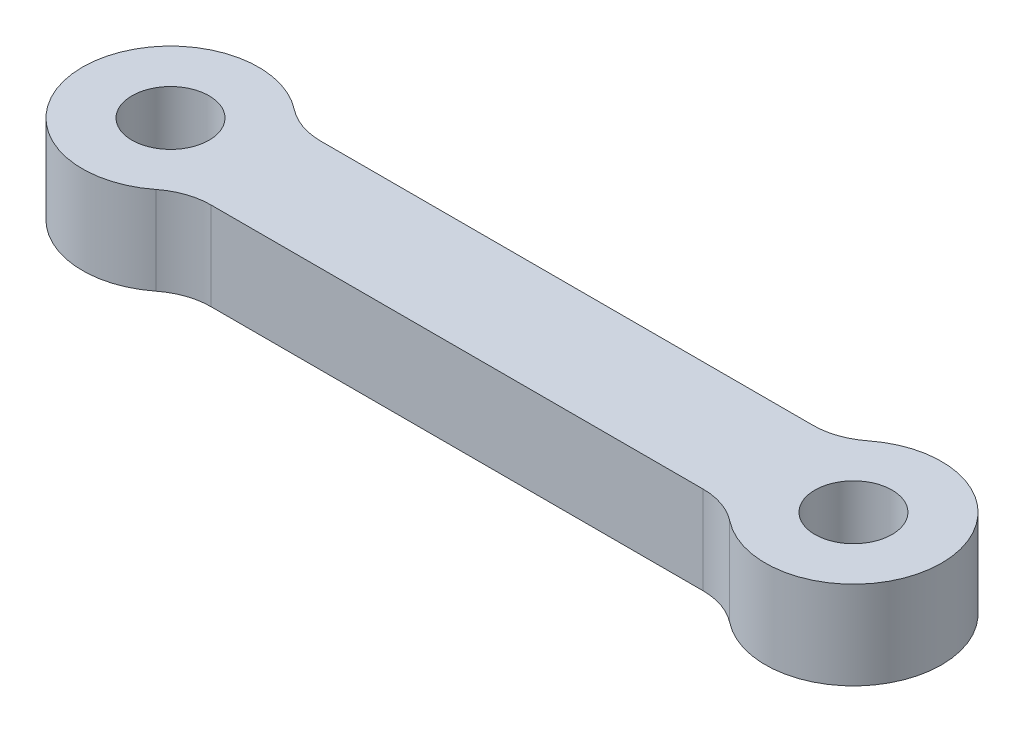
ISO-10303-21;
HEADER;
FILE_DESCRIPTION(('STEP AP214'),'2;1');
FILE_NAME('part.step','',(''),(''),'','','');
FILE_SCHEMA(('AUTOMOTIVE_DESIGN { 1 0 10303 214 1 1 1 1 }'));
ENDSEC;
DATA;
#1=APPLICATION_CONTEXT('core data for automotive mechanical design processes');
#2=APPLICATION_PROTOCOL_DEFINITION('international standard','automotive_design',2000,#1);
#3=PRODUCT_CONTEXT('',#1,'mechanical');
#4=PRODUCT('Part','Part','',(#3));
#5=PRODUCT_RELATED_PRODUCT_CATEGORY('part','',(#4));
#6=PRODUCT_DEFINITION_FORMATION('','',#4);
#7=PRODUCT_DEFINITION_CONTEXT('part definition',#1,'design');
#8=PRODUCT_DEFINITION('design','',#6,#7);
#9=PRODUCT_DEFINITION_SHAPE('','',#8);
#10=(LENGTH_UNIT() NAMED_UNIT(*) SI_UNIT(.MILLI.,.METRE.));
#11=(NAMED_UNIT(*) PLANE_ANGLE_UNIT() SI_UNIT($,.RADIAN.));
#12=(NAMED_UNIT(*) SI_UNIT($,.STERADIAN.) SOLID_ANGLE_UNIT());
#13=UNCERTAINTY_MEASURE_WITH_UNIT(LENGTH_MEASURE(1.E-05),#10,'distance_accuracy_value','');
#14=(GEOMETRIC_REPRESENTATION_CONTEXT(3) GLOBAL_UNCERTAINTY_ASSIGNED_CONTEXT((#13)) GLOBAL_UNIT_ASSIGNED_CONTEXT((#10,
#11,#12)) REPRESENTATION_CONTEXT('',''));
#15=CARTESIAN_POINT('',(0.,0.,0.));
#16=DIRECTION('',(0.,0.,1.));
#17=DIRECTION('',(1.,0.,0.));
#18=AXIS2_PLACEMENT_3D('',#15,#16,#17);
#19=CARTESIAN_POINT('',(31.,4.,0.));
#20=DIRECTION('',(0.,-1.,0.));
#21=DIRECTION('',(0.,0.,-1.));
#22=AXIS2_PLACEMENT_3D('',#19,#20,#21);
#23=CYLINDRICAL_SURFACE('',#22,4.00000000000001);
#24=CARTESIAN_POINT('',(31.,4.,0.));
#25=DIRECTION('',(0.,1.,0.));
#26=DIRECTION('',(0.,0.,1.));
#27=AXIS2_PLACEMENT_3D('',#24,#25,#26);
#28=CIRCLE('',#27,4.00000000000001);
#29=CARTESIAN_POINT('',(28.525641703473,4.,3.14285714285714));
#30=VERTEX_POINT('',#29);
#31=CARTESIAN_POINT('',(28.525641703473,4.,-3.14285714285714));
#32=VERTEX_POINT('',#31);
#33=EDGE_CURVE('E129',#30,#32,#28,.T.);
#34=ORIENTED_EDGE('',*,*,#33,.F.);
#35=DIRECTION('',(0.,-1.,0.));
#36=VECTOR('',#35,1.);
#37=CARTESIAN_POINT('',(28.525641703473,4.,3.14285714285714));
#38=LINE('',#37,#36);
#39=CARTESIAN_POINT('',(28.525641703473,0.,3.14285714285714));
#40=VERTEX_POINT('',#39);
#41=EDGE_CURVE('E115',#30,#40,#38,.T.);
#42=ORIENTED_EDGE('',*,*,#41,.T.);
#43=CARTESIAN_POINT('',(31.,0.,0.));
#44=DIRECTION('',(0.,1.,0.));
#45=DIRECTION('',(0.,0.,1.));
#46=AXIS2_PLACEMENT_3D('',#43,#44,#45);
#47=CIRCLE('',#46,4.00000000000001);
#48=CARTESIAN_POINT('',(28.525641703473,0.,-3.14285714285714));
#49=VERTEX_POINT('',#48);
#50=EDGE_CURVE('E127',#40,#49,#47,.T.);
#51=ORIENTED_EDGE('',*,*,#50,.T.);
#52=DIRECTION('',(0.,-1.,0.));
#53=VECTOR('',#52,1.);
#54=CARTESIAN_POINT('',(28.525641703473,4.,-3.14285714285714));
#55=LINE('',#54,#53);
#56=EDGE_CURVE('E132',#49,#32,#55,.F.);
#57=ORIENTED_EDGE('',*,*,#56,.T.);
#58=EDGE_LOOP('',(#34,#42,#51,#57));
#59=FACE_BOUND('',#58,.T.);
#60=ADVANCED_FACE('F44',(#59),#23,.T.);
#61=CARTESIAN_POINT('',(0.,4.,-2.5));
#62=DIRECTION('',(0.,0.,-1.));
#63=DIRECTION('',(-1.,0.,0.));
#64=AXIS2_PLACEMENT_3D('',#61,#62,#63);
#65=PLANE('',#64);
#66=DIRECTION('',(1.,0.,0.));
#67=VECTOR('',#66,1.);
#68=CARTESIAN_POINT('',(0.,0.,-2.5));
#69=LINE('',#68,#67);
#70=CARTESIAN_POINT('',(4.3301270189222,0.,-2.5));
#71=VERTEX_POINT('',#70);
#72=CARTESIAN_POINT('',(26.6698729810778,0.,-2.5));
#73=VERTEX_POINT('',#72);
#74=EDGE_CURVE('E139',#71,#73,#69,.T.);
#75=ORIENTED_EDGE('',*,*,#74,.F.);
#76=DIRECTION('',(0.,-1.,0.));
#77=VECTOR('',#76,1.);
#78=CARTESIAN_POINT('',(4.3301270189222,4.,-2.5));
#79=LINE('',#78,#77);
#80=CARTESIAN_POINT('',(4.3301270189222,4.,-2.5));
#81=VERTEX_POINT('',#80);
#82=EDGE_CURVE('E67',#71,#81,#79,.F.);
#83=ORIENTED_EDGE('',*,*,#82,.T.);
#84=DIRECTION('',(1.,0.,0.));
#85=VECTOR('',#84,1.);
#86=CARTESIAN_POINT('',(0.,4.,-2.5));
#87=LINE('',#86,#85);
#88=CARTESIAN_POINT('',(26.6698729810778,4.,-2.5));
#89=VERTEX_POINT('',#88);
#90=EDGE_CURVE('E219',#81,#89,#87,.T.);
#91=ORIENTED_EDGE('',*,*,#90,.T.);
#92=DIRECTION('',(0.,-1.,0.));
#93=VECTOR('',#92,1.);
#94=CARTESIAN_POINT('',(26.6698729810778,4.,-2.5));
#95=LINE('',#94,#93);
#96=EDGE_CURVE('E178',#89,#73,#95,.T.);
#97=ORIENTED_EDGE('',*,*,#96,.T.);
#98=EDGE_LOOP('',(#75,#83,#91,#97));
#99=FACE_BOUND('',#98,.T.);
#100=ADVANCED_FACE('F227',(#99),#65,.T.);
#101=CARTESIAN_POINT('',(0.,4.,0.));
#102=DIRECTION('',(0.,-1.,0.));
#103=DIRECTION('',(0.,0.,-1.));
#104=AXIS2_PLACEMENT_3D('',#101,#102,#103);
#105=CYLINDRICAL_SURFACE('',#104,4.);
#106=CARTESIAN_POINT('',(0.,4.,0.));
#107=DIRECTION('',(0.,1.,0.));
#108=DIRECTION('',(0.,0.,1.));
#109=AXIS2_PLACEMENT_3D('',#106,#107,#108);
#110=CIRCLE('',#109,4.);
#111=CARTESIAN_POINT('',(2.47435829652697,4.,-3.14285714285714));
#112=VERTEX_POINT('',#111);
#113=CARTESIAN_POINT('',(2.47435829652697,4.,3.14285714285714));
#114=VERTEX_POINT('',#113);
#115=EDGE_CURVE('E210',#112,#114,#110,.T.);
#116=ORIENTED_EDGE('',*,*,#115,.F.);
#117=DIRECTION('',(0.,-1.,0.));
#118=VECTOR('',#117,1.);
#119=CARTESIAN_POINT('',(2.47435829652697,4.,-3.14285714285714));
#120=LINE('',#119,#118);
#121=CARTESIAN_POINT('',(2.47435829652697,0.,-3.14285714285714));
#122=VERTEX_POINT('',#121);
#123=EDGE_CURVE('E174',#112,#122,#120,.T.);
#124=ORIENTED_EDGE('',*,*,#123,.T.);
#125=CARTESIAN_POINT('',(0.,0.,0.));
#126=DIRECTION('',(0.,1.,0.));
#127=DIRECTION('',(0.,0.,1.));
#128=AXIS2_PLACEMENT_3D('',#125,#126,#127);
#129=CIRCLE('',#128,4.);
#130=CARTESIAN_POINT('',(2.47435829652697,0.,3.14285714285714));
#131=VERTEX_POINT('',#130);
#132=EDGE_CURVE('E144',#122,#131,#129,.T.);
#133=ORIENTED_EDGE('',*,*,#132,.T.);
#134=DIRECTION('',(0.,-1.,0.));
#135=VECTOR('',#134,1.);
#136=CARTESIAN_POINT('',(2.47435829652697,4.,3.14285714285714));
#137=LINE('',#136,#135);
#138=EDGE_CURVE('E171',#131,#114,#137,.F.);
#139=ORIENTED_EDGE('',*,*,#138,.T.);
#140=EDGE_LOOP('',(#116,#124,#133,#139));
#141=FACE_BOUND('',#140,.T.);
#142=ADVANCED_FACE('F201',(#141),#105,.T.);
#143=CARTESIAN_POINT('',(0.,4.,0.));
#144=DIRECTION('',(0.,-1.,0.));
#145=DIRECTION('',(0.,0.,-1.));
#146=AXIS2_PLACEMENT_3D('',#143,#144,#145);
#147=CYLINDRICAL_SURFACE('',#146,1.75);
#148=CARTESIAN_POINT('',(0.,4.,0.));
#149=DIRECTION('',(0.,1.,0.));
#150=DIRECTION('',(0.,0.,1.));
#151=AXIS2_PLACEMENT_3D('',#148,#149,#150);
#152=CIRCLE('',#151,1.75);
#153=CARTESIAN_POINT('',(0.,4.,1.75));
#154=VERTEX_POINT('',#153);
#155=EDGE_CURVE('E214',#154,#154,#152,.T.);
#156=ORIENTED_EDGE('',*,*,#155,.T.);
#157=EDGE_LOOP('',(#156));
#158=FACE_BOUND('',#157,.T.);
#159=CARTESIAN_POINT('',(0.,0.,0.));
#160=DIRECTION('',(0.,1.,0.));
#161=DIRECTION('',(0.,0.,1.));
#162=AXIS2_PLACEMENT_3D('',#159,#160,#161);
#163=CIRCLE('',#162,1.75);
#164=CARTESIAN_POINT('',(0.,0.,1.75));
#165=VERTEX_POINT('',#164);
#166=EDGE_CURVE('E156',#165,#165,#163,.T.);
#167=ORIENTED_EDGE('',*,*,#166,.F.);
#168=EDGE_LOOP('',(#167));
#169=FACE_BOUND('',#168,.T.);
#170=ADVANCED_FACE('F247',(#158,#169),#147,.F.);
#171=CARTESIAN_POINT('',(0.,4.,2.5));
#172=DIRECTION('',(0.,0.,-1.));
#173=DIRECTION('',(-1.,0.,0.));
#174=AXIS2_PLACEMENT_3D('',#171,#172,#173);
#175=PLANE('',#174);
#176=DIRECTION('',(1.,0.,0.));
#177=VECTOR('',#176,1.);
#178=CARTESIAN_POINT('',(0.,0.,2.5));
#179=LINE('',#178,#177);
#180=CARTESIAN_POINT('',(4.3301270189222,0.,2.5));
#181=VERTEX_POINT('',#180);
#182=CARTESIAN_POINT('',(26.6698729810778,0.,2.5));
#183=VERTEX_POINT('',#182);
#184=EDGE_CURVE('E153',#181,#183,#179,.T.);
#185=ORIENTED_EDGE('',*,*,#184,.T.);
#186=DIRECTION('',(0.,1.,0.));
#187=VECTOR('',#186,1.);
#188=CARTESIAN_POINT('',(26.6698729810778,4.,2.5));
#189=LINE('',#188,#187);
#190=CARTESIAN_POINT('',(26.6698729810778,4.,2.5));
#191=VERTEX_POINT('',#190);
#192=EDGE_CURVE('E116',#183,#191,#189,.T.);
#193=ORIENTED_EDGE('',*,*,#192,.T.);
#194=DIRECTION('',(1.,0.,0.));
#195=VECTOR('',#194,1.);
#196=CARTESIAN_POINT('',(0.,4.,2.5));
#197=LINE('',#196,#195);
#198=CARTESIAN_POINT('',(4.3301270189222,4.,2.5));
#199=VERTEX_POINT('',#198);
#200=EDGE_CURVE('E209',#199,#191,#197,.T.);
#201=ORIENTED_EDGE('',*,*,#200,.F.);
#202=DIRECTION('',(0.,1.,0.));
#203=VECTOR('',#202,1.);
#204=CARTESIAN_POINT('',(4.3301270189222,0.,2.5));
#205=LINE('',#204,#203);
#206=EDGE_CURVE('E131',#199,#181,#205,.F.);
#207=ORIENTED_EDGE('',*,*,#206,.T.);
#208=EDGE_LOOP('',(#185,#193,#201,#207));
#209=FACE_BOUND('',#208,.T.);
#210=ADVANCED_FACE('F212',(#209),#175,.F.);
#211=CARTESIAN_POINT('',(31.,4.,0.));
#212=DIRECTION('',(0.,-1.,0.));
#213=DIRECTION('',(0.,0.,-1.));
#214=AXIS2_PLACEMENT_3D('',#211,#212,#213);
#215=CYLINDRICAL_SURFACE('',#214,1.75);
#216=CARTESIAN_POINT('',(31.,4.,0.));
#217=DIRECTION('',(0.,1.,0.));
#218=DIRECTION('',(0.,0.,1.));
#219=AXIS2_PLACEMENT_3D('',#216,#217,#218);
#220=CIRCLE('',#219,1.75);
#221=CARTESIAN_POINT('',(31.,4.,1.75));
#222=VERTEX_POINT('',#221);
#223=EDGE_CURVE('E147',#222,#222,#220,.T.);
#224=ORIENTED_EDGE('',*,*,#223,.T.);
#225=EDGE_LOOP('',(#224));
#226=FACE_BOUND('',#225,.T.);
#227=CARTESIAN_POINT('',(31.,0.,0.));
#228=DIRECTION('',(0.,1.,0.));
#229=DIRECTION('',(0.,0.,1.));
#230=AXIS2_PLACEMENT_3D('',#227,#228,#229);
#231=CIRCLE('',#230,1.75);
#232=CARTESIAN_POINT('',(31.,0.,1.75));
#233=VERTEX_POINT('',#232);
#234=EDGE_CURVE('E160',#233,#233,#231,.T.);
#235=ORIENTED_EDGE('',*,*,#234,.F.);
#236=EDGE_LOOP('',(#235));
#237=FACE_BOUND('',#236,.T.);
#238=ADVANCED_FACE('F250',(#226,#237),#215,.F.);
#239=CARTESIAN_POINT('',(0.,4.,0.));
#240=DIRECTION('',(0.,1.,0.));
#241=DIRECTION('',(0.,0.,1.));
#242=AXIS2_PLACEMENT_3D('',#239,#240,#241);
#243=PLANE('',#242);
#244=ORIENTED_EDGE('',*,*,#200,.T.);
#245=CARTESIAN_POINT('',(26.6698729810778,4.,5.5));
#246=DIRECTION('',(0.,1.,0.));
#247=DIRECTION('',(0.,0.,1.));
#248=AXIS2_PLACEMENT_3D('',#245,#246,#247);
#249=CIRCLE('',#248,3.);
#250=EDGE_CURVE('E122',#191,#30,#249,.F.);
#251=ORIENTED_EDGE('',*,*,#250,.T.);
#252=ORIENTED_EDGE('',*,*,#33,.T.);
#253=CARTESIAN_POINT('',(26.6698729810778,4.,-5.5));
#254=DIRECTION('',(0.,1.,0.));
#255=DIRECTION('',(0.,0.,1.));
#256=AXIS2_PLACEMENT_3D('',#253,#254,#255);
#257=CIRCLE('',#256,3.);
#258=EDGE_CURVE('E60',#32,#89,#257,.F.);
#259=ORIENTED_EDGE('',*,*,#258,.T.);
#260=ORIENTED_EDGE('',*,*,#90,.F.);
#261=CARTESIAN_POINT('',(4.3301270189222,4.,-5.5));
#262=DIRECTION('',(0.,1.,0.));
#263=DIRECTION('',(0.,0.,1.));
#264=AXIS2_PLACEMENT_3D('',#261,#262,#263);
#265=CIRCLE('',#264,3.);
#266=EDGE_CURVE('E189',#81,#112,#265,.F.);
#267=ORIENTED_EDGE('',*,*,#266,.T.);
#268=ORIENTED_EDGE('',*,*,#115,.T.);
#269=CARTESIAN_POINT('',(4.3301270189222,4.,5.5));
#270=DIRECTION('',(0.,1.,0.));
#271=DIRECTION('',(0.,0.,1.));
#272=AXIS2_PLACEMENT_3D('',#269,#270,#271);
#273=CIRCLE('',#272,3.);
#274=EDGE_CURVE('E11',#114,#199,#273,.F.);
#275=ORIENTED_EDGE('',*,*,#274,.T.);
#276=EDGE_LOOP('',(#244,#251,#252,#259,#260,#267,#268,#275));
#277=FACE_BOUND('',#276,.T.);
#278=ORIENTED_EDGE('',*,*,#155,.F.);
#279=EDGE_LOOP('',(#278));
#280=FACE_BOUND('',#279,.T.);
#281=ORIENTED_EDGE('',*,*,#223,.F.);
#282=EDGE_LOOP('',(#281));
#283=FACE_BOUND('',#282,.T.);
#284=ADVANCED_FACE('F207',(#277,#280,#283),#243,.T.);
#285=CARTESIAN_POINT('',(0.,0.,0.));
#286=DIRECTION('',(0.,1.,0.));
#287=DIRECTION('',(0.,0.,1.));
#288=AXIS2_PLACEMENT_3D('',#285,#286,#287);
#289=PLANE('',#288);
#290=ORIENTED_EDGE('',*,*,#50,.F.);
#291=CARTESIAN_POINT('',(26.6698729810778,0.,5.5));
#292=DIRECTION('',(0.,1.,0.));
#293=DIRECTION('',(0.,0.,1.));
#294=AXIS2_PLACEMENT_3D('',#291,#292,#293);
#295=CIRCLE('',#294,3.);
#296=EDGE_CURVE('E111',#40,#183,#295,.T.);
#297=ORIENTED_EDGE('',*,*,#296,.T.);
#298=ORIENTED_EDGE('',*,*,#184,.F.);
#299=CARTESIAN_POINT('',(4.3301270189222,0.,5.5));
#300=DIRECTION('',(0.,1.,0.));
#301=DIRECTION('',(0.,0.,1.));
#302=AXIS2_PLACEMENT_3D('',#299,#300,#301);
#303=CIRCLE('',#302,3.);
#304=EDGE_CURVE('E53',#181,#131,#303,.T.);
#305=ORIENTED_EDGE('',*,*,#304,.T.);
#306=ORIENTED_EDGE('',*,*,#132,.F.);
#307=CARTESIAN_POINT('',(4.3301270189222,0.,-5.5));
#308=DIRECTION('',(0.,1.,0.));
#309=DIRECTION('',(0.,0.,1.));
#310=AXIS2_PLACEMENT_3D('',#307,#308,#309);
#311=CIRCLE('',#310,3.);
#312=EDGE_CURVE('E186',#122,#71,#311,.T.);
#313=ORIENTED_EDGE('',*,*,#312,.T.);
#314=ORIENTED_EDGE('',*,*,#74,.T.);
#315=CARTESIAN_POINT('',(26.6698729810778,0.,-5.5));
#316=DIRECTION('',(0.,1.,0.));
#317=DIRECTION('',(0.,0.,1.));
#318=AXIS2_PLACEMENT_3D('',#315,#316,#317);
#319=CIRCLE('',#318,3.);
#320=EDGE_CURVE('E137',#73,#49,#319,.T.);
#321=ORIENTED_EDGE('',*,*,#320,.T.);
#322=EDGE_LOOP('',(#290,#297,#298,#305,#306,#313,#314,#321));
#323=FACE_BOUND('',#322,.T.);
#324=ORIENTED_EDGE('',*,*,#166,.T.);
#325=EDGE_LOOP('',(#324));
#326=FACE_BOUND('',#325,.T.);
#327=ORIENTED_EDGE('',*,*,#234,.T.);
#328=EDGE_LOOP('',(#327));
#329=FACE_BOUND('',#328,.T.);
#330=ADVANCED_FACE('F134',(#323,#326,#329),#289,.F.);
#331=CARTESIAN_POINT('',(26.6698729810778,4.,5.5));
#332=DIRECTION('',(0.,-1.,0.));
#333=DIRECTION('',(0.,0.,-1.));
#334=AXIS2_PLACEMENT_3D('',#331,#332,#333);
#335=CYLINDRICAL_SURFACE('',#334,3.);
#336=ORIENTED_EDGE('',*,*,#250,.F.);
#337=ORIENTED_EDGE('',*,*,#192,.F.);
#338=ORIENTED_EDGE('',*,*,#296,.F.);
#339=ORIENTED_EDGE('',*,*,#41,.F.);
#340=EDGE_LOOP('',(#336,#337,#338,#339));
#341=FACE_BOUND('',#340,.T.);
#342=ADVANCED_FACE('F114',(#341),#335,.F.);
#343=CARTESIAN_POINT('',(4.3301270189222,4.,-5.5));
#344=DIRECTION('',(0.,-1.,0.));
#345=DIRECTION('',(0.,0.,-1.));
#346=AXIS2_PLACEMENT_3D('',#343,#344,#345);
#347=CYLINDRICAL_SURFACE('',#346,3.);
#348=ORIENTED_EDGE('',*,*,#266,.F.);
#349=ORIENTED_EDGE('',*,*,#82,.F.);
#350=ORIENTED_EDGE('',*,*,#312,.F.);
#351=ORIENTED_EDGE('',*,*,#123,.F.);
#352=EDGE_LOOP('',(#348,#349,#350,#351));
#353=FACE_BOUND('',#352,.T.);
#354=ADVANCED_FACE('F230',(#353),#347,.F.);
#355=CARTESIAN_POINT('',(26.6698729810778,4.,-5.5));
#356=DIRECTION('',(0.,-1.,0.));
#357=DIRECTION('',(0.,0.,-1.));
#358=AXIS2_PLACEMENT_3D('',#355,#356,#357);
#359=CYLINDRICAL_SURFACE('',#358,3.);
#360=ORIENTED_EDGE('',*,*,#258,.F.);
#361=ORIENTED_EDGE('',*,*,#56,.F.);
#362=ORIENTED_EDGE('',*,*,#320,.F.);
#363=ORIENTED_EDGE('',*,*,#96,.F.);
#364=EDGE_LOOP('',(#360,#361,#362,#363));
#365=FACE_BOUND('',#364,.T.);
#366=ADVANCED_FACE('F226',(#365),#359,.F.);
#367=CARTESIAN_POINT('',(4.3301270189222,4.,5.5));
#368=DIRECTION('',(0.,-1.,0.));
#369=DIRECTION('',(0.,0.,-1.));
#370=AXIS2_PLACEMENT_3D('',#367,#368,#369);
#371=CYLINDRICAL_SURFACE('',#370,3.);
#372=ORIENTED_EDGE('',*,*,#274,.F.);
#373=ORIENTED_EDGE('',*,*,#138,.F.);
#374=ORIENTED_EDGE('',*,*,#304,.F.);
#375=ORIENTED_EDGE('',*,*,#206,.F.);
#376=EDGE_LOOP('',(#372,#373,#374,#375));
#377=FACE_BOUND('',#376,.T.);
#378=ADVANCED_FACE('F46',(#377),#371,.F.);
#379=CLOSED_SHELL('',(#60,#100,#142,#170,#210,#238,#284,#330,#342,#354,#366,#378));
#380=MANIFOLD_SOLID_BREP('B2',#379);
#381=ADVANCED_BREP_SHAPE_REPRESENTATION('',(#18,#380),#14);
#382=SHAPE_DEFINITION_REPRESENTATION(#9,#381);
ENDSEC;
END-ISO-10303-21;
